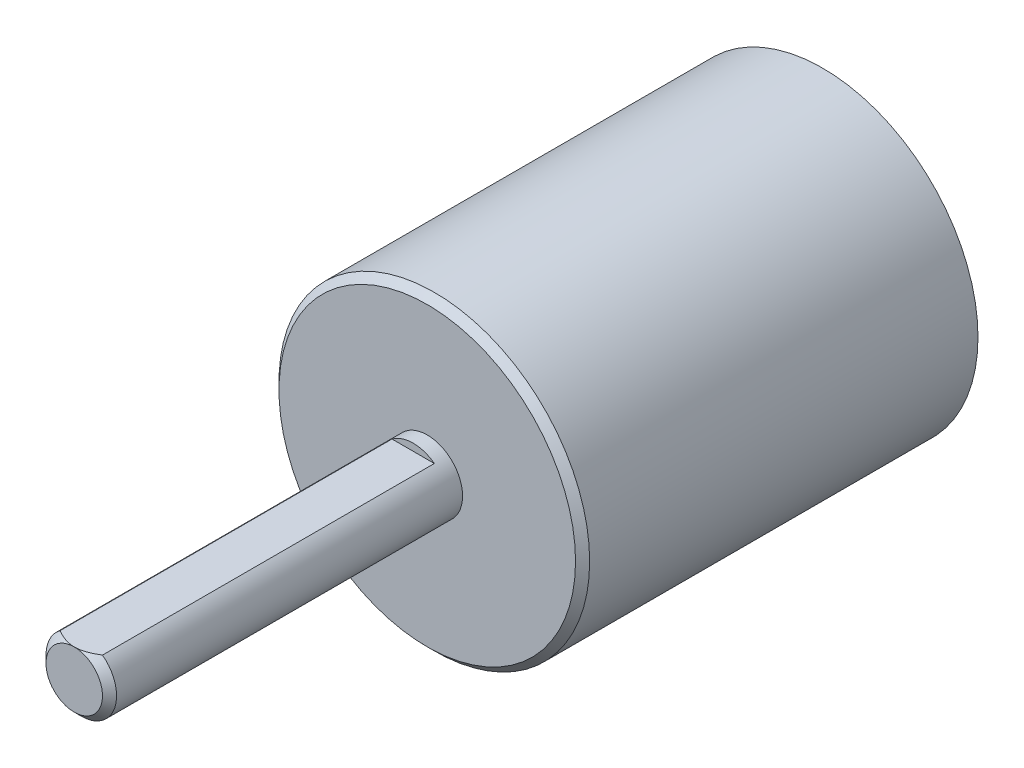
ISO-10303-21;
HEADER;
FILE_DESCRIPTION(('STEP AP214'),'2;1');
FILE_NAME('part.step','',(''),(''),'','','');
FILE_SCHEMA(('AUTOMOTIVE_DESIGN { 1 0 10303 214 1 1 1 1 }'));
ENDSEC;
DATA;
#1=APPLICATION_CONTEXT('core data for automotive mechanical design processes');
#2=APPLICATION_PROTOCOL_DEFINITION('international standard','automotive_design',2000,#1);
#3=PRODUCT_CONTEXT('',#1,'mechanical');
#4=PRODUCT('Part','Part','',(#3));
#5=PRODUCT_RELATED_PRODUCT_CATEGORY('part','',(#4));
#6=PRODUCT_DEFINITION_FORMATION('','',#4);
#7=PRODUCT_DEFINITION_CONTEXT('part definition',#1,'design');
#8=PRODUCT_DEFINITION('design','',#6,#7);
#9=PRODUCT_DEFINITION_SHAPE('','',#8);
#10=(LENGTH_UNIT() NAMED_UNIT(*) SI_UNIT(.MILLI.,.METRE.));
#11=(NAMED_UNIT(*) PLANE_ANGLE_UNIT() SI_UNIT($,.RADIAN.));
#12=(NAMED_UNIT(*) SI_UNIT($,.STERADIAN.) SOLID_ANGLE_UNIT());
#13=UNCERTAINTY_MEASURE_WITH_UNIT(LENGTH_MEASURE(1.E-05),#10,'distance_accuracy_value','');
#14=(GEOMETRIC_REPRESENTATION_CONTEXT(3) GLOBAL_UNCERTAINTY_ASSIGNED_CONTEXT((#13)) GLOBAL_UNIT_ASSIGNED_CONTEXT((#10,
#11,#12)) REPRESENTATION_CONTEXT('',''));
#15=CARTESIAN_POINT('',(0.,0.,0.));
#16=DIRECTION('',(0.,0.,1.));
#17=DIRECTION('',(1.,0.,0.));
#18=AXIS2_PLACEMENT_3D('',#15,#16,#17);
#19=CARTESIAN_POINT('',(0.,0.,53.));
#20=DIRECTION('',(0.,0.,-1.));
#21=DIRECTION('',(-1.,0.,0.));
#22=AXIS2_PLACEMENT_3D('',#19,#20,#21);
#23=CYLINDRICAL_SURFACE('',#22,2.5);
#24=CARTESIAN_POINT('',(0.,0.,28.));
#25=DIRECTION('',(0.,0.,1.));
#26=DIRECTION('',(1.,0.,0.));
#27=AXIS2_PLACEMENT_3D('',#24,#25,#26);
#28=CIRCLE('',#27,2.5);
#29=CARTESIAN_POINT('',(2.5,0.,28.));
#30=VERTEX_POINT('',#29);
#31=EDGE_CURVE('E100',#30,#30,#28,.T.);
#32=ORIENTED_EDGE('',*,*,#31,.T.);
#33=EDGE_LOOP('',(#32));
#34=FACE_BOUND('',#33,.T.);
#35=DIRECTION('',(0.,0.,1.));
#36=VECTOR('',#35,1.);
#37=CARTESIAN_POINT('',(1.5,2.,29.));
#38=LINE('',#37,#36);
#39=CARTESIAN_POINT('',(1.5,2.,29.));
#40=VERTEX_POINT('',#39);
#41=CARTESIAN_POINT('',(1.5,2.,52.5));
#42=VERTEX_POINT('',#41);
#43=EDGE_CURVE('E85',#40,#42,#38,.T.);
#44=ORIENTED_EDGE('',*,*,#43,.T.);
#45=CARTESIAN_POINT('',(0.,0.,52.5));
#46=DIRECTION('',(0.,0.,1.));
#47=DIRECTION('',(1.,0.,0.));
#48=AXIS2_PLACEMENT_3D('',#45,#46,#47);
#49=CIRCLE('',#48,2.5);
#50=CARTESIAN_POINT('',(-1.5,2.,52.5));
#51=VERTEX_POINT('',#50);
#52=EDGE_CURVE('E11',#42,#51,#49,.F.);
#53=ORIENTED_EDGE('',*,*,#52,.T.);
#54=DIRECTION('',(0.,0.,1.));
#55=VECTOR('',#54,1.);
#56=CARTESIAN_POINT('',(-1.5,2.,29.));
#57=LINE('',#56,#55);
#58=CARTESIAN_POINT('',(-1.5,2.,29.));
#59=VERTEX_POINT('',#58);
#60=EDGE_CURVE('E83',#59,#51,#57,.T.);
#61=ORIENTED_EDGE('',*,*,#60,.F.);
#62=CARTESIAN_POINT('',(0.,0.,29.));
#63=DIRECTION('',(0.,0.,1.));
#64=DIRECTION('',(1.,0.,0.));
#65=AXIS2_PLACEMENT_3D('',#62,#63,#64);
#66=CIRCLE('',#65,2.5);
#67=EDGE_CURVE('E89',#40,#59,#66,.T.);
#68=ORIENTED_EDGE('',*,*,#67,.F.);
#69=EDGE_LOOP('',(#44,#53,#61,#68));
#70=FACE_BOUND('',#69,.T.);
#71=ADVANCED_FACE('F49',(#34,#70),#23,.T.);
#72=CARTESIAN_POINT('',(0.,0.,53.));
#73=DIRECTION('',(0.,0.,1.));
#74=DIRECTION('',(1.,0.,0.));
#75=AXIS2_PLACEMENT_3D('',#72,#73,#74);
#76=PLANE('',#75);
#77=CARTESIAN_POINT('',(0.,0.,53.));
#78=DIRECTION('',(0.,0.,1.));
#79=DIRECTION('',(1.,0.,0.));
#80=AXIS2_PLACEMENT_3D('',#77,#78,#79);
#81=CIRCLE('',#80,2.00000000000001);
#82=CARTESIAN_POINT('',(0.,2.,53.));
#83=VERTEX_POINT('',#82);
#84=EDGE_CURVE('E115',#83,#83,#81,.T.);
#85=ORIENTED_EDGE('',*,*,#84,.T.);
#86=EDGE_LOOP('',(#85));
#87=FACE_BOUND('',#86,.T.);
#88=ADVANCED_FACE('F135',(#87),#76,.T.);
#89=CARTESIAN_POINT('',(0.,0.,28.));
#90=DIRECTION('',(0.,0.,-1.));
#91=DIRECTION('',(-1.,0.,0.));
#92=AXIS2_PLACEMENT_3D('',#89,#90,#91);
#93=CYLINDRICAL_SURFACE('',#92,11.);
#94=CARTESIAN_POINT('',(0.,0.,27.5));
#95=DIRECTION('',(0.,0.,1.));
#96=DIRECTION('',(1.,0.,0.));
#97=AXIS2_PLACEMENT_3D('',#94,#95,#96);
#98=CIRCLE('',#97,11.);
#99=CARTESIAN_POINT('',(11.,0.,27.5));
#100=VERTEX_POINT('',#99);
#101=EDGE_CURVE('E111',#100,#100,#98,.F.);
#102=ORIENTED_EDGE('',*,*,#101,.T.);
#103=EDGE_LOOP('',(#102));
#104=FACE_BOUND('',#103,.T.);
#105=CARTESIAN_POINT('',(0.,0.,0.));
#106=DIRECTION('',(0.,0.,1.));
#107=DIRECTION('',(1.,0.,0.));
#108=AXIS2_PLACEMENT_3D('',#105,#106,#107);
#109=CIRCLE('',#108,11.);
#110=CARTESIAN_POINT('',(11.,0.,0.));
#111=VERTEX_POINT('',#110);
#112=EDGE_CURVE('E97',#111,#111,#109,.T.);
#113=ORIENTED_EDGE('',*,*,#112,.T.);
#114=EDGE_LOOP('',(#113));
#115=FACE_BOUND('',#114,.T.);
#116=ADVANCED_FACE('F139',(#104,#115),#93,.T.);
#117=CARTESIAN_POINT('',(0.,0.,28.));
#118=DIRECTION('',(0.,0.,1.));
#119=DIRECTION('',(1.,0.,0.));
#120=AXIS2_PLACEMENT_3D('',#117,#118,#119);
#121=PLANE('',#120);
#122=CARTESIAN_POINT('',(0.,0.,28.));
#123=DIRECTION('',(0.,0.,1.));
#124=DIRECTION('',(1.,0.,0.));
#125=AXIS2_PLACEMENT_3D('',#122,#123,#124);
#126=CIRCLE('',#125,10.5);
#127=CARTESIAN_POINT('',(10.5,0.,28.));
#128=VERTEX_POINT('',#127);
#129=EDGE_CURVE('E104',#128,#128,#126,.T.);
#130=ORIENTED_EDGE('',*,*,#129,.T.);
#131=EDGE_LOOP('',(#130));
#132=FACE_BOUND('',#131,.T.);
#133=ORIENTED_EDGE('',*,*,#31,.F.);
#134=EDGE_LOOP('',(#133));
#135=FACE_BOUND('',#134,.T.);
#136=ADVANCED_FACE('F144',(#132,#135),#121,.T.);
#137=CARTESIAN_POINT('',(0.,0.,0.));
#138=DIRECTION('',(0.,0.,1.));
#139=DIRECTION('',(1.,0.,0.));
#140=AXIS2_PLACEMENT_3D('',#137,#138,#139);
#141=PLANE('',#140);
#142=ORIENTED_EDGE('',*,*,#112,.F.);
#143=EDGE_LOOP('',(#142));
#144=FACE_BOUND('',#143,.T.);
#145=ADVANCED_FACE('F134',(#144),#141,.F.);
#146=CARTESIAN_POINT('',(0.,2.,29.));
#147=DIRECTION('',(0.,1.,0.));
#148=DIRECTION('',(0.,0.,1.));
#149=AXIS2_PLACEMENT_3D('',#146,#147,#148);
#150=PLANE('',#149);
#151=CARTESIAN_POINT('',(-1.5,2.,52.5));
#152=CARTESIAN_POINT('',(-1.42763018659213,2.,52.5433736980276));
#153=CARTESIAN_POINT('',(-1.35436226532257,2.,52.5853687019536));
#154=CARTESIAN_POINT('',(-1.20549660628809,2.,52.6656443583189));
#155=CARTESIAN_POINT('',(-1.12989157710705,2.,52.7039114197062));
#156=CARTESIAN_POINT('',(-0.978296734874827,2.,52.774534191742));
#157=CARTESIAN_POINT('',(-0.902366736266402,2.,52.8070165390548));
#158=CARTESIAN_POINT('',(-0.748220644904069,2.,52.865809016699));
#159=CARTESIAN_POINT('',(-0.670007876047701,2.,52.8921276624893));
#160=CARTESIAN_POINT('',(-0.543060600019243,2.,52.9280861032667));
#161=CARTESIAN_POINT('',(-0.495021163503641,2.,52.9401901027996));
#162=CARTESIAN_POINT('',(-0.398260419217582,2.,52.9612794306282));
#163=CARTESIAN_POINT('',(-0.349539198139855,2.,52.9702651517484));
#164=CARTESIAN_POINT('',(-0.250852177401959,2.,52.9849271240241));
#165=CARTESIAN_POINT('',(-0.20087865403863,2.,52.9905520018212));
#166=CARTESIAN_POINT('',(-0.100607619276172,2.,52.9981023484678));
#167=CARTESIAN_POINT('',(-0.0503098472705266,2.,53.0000243314446));
#168=CARTESIAN_POINT('',(0.,2.,53.));
#169=B_SPLINE_CURVE_WITH_KNOTS('',3,(#151,#152,#153,#154,#155,#156,#157,#158,#159,#160,#161,
#162,#163,#164,#165,#166,#167,#168),.UNSPECIFIED.,.F.,.F.,(4,2,2,2,2,2,2,2,4),(0.,
0.253195034695597,0.507281075974288,0.754837752612879,1.00205037282501,1.15058504578388,
1.29910100031797,1.44983263801686,1.60070610394699),.UNSPECIFIED.);
#170=EDGE_CURVE('E119',#51,#83,#169,.T.);
#171=ORIENTED_EDGE('',*,*,#170,.T.);
#172=CARTESIAN_POINT('',(0.,2.00000000000001,53.));
#173=CARTESIAN_POINT('',(0.0614966481035623,2.,53.0000514930088));
#174=CARTESIAN_POINT('',(0.12296179611878,2.,52.997164788165));
#175=CARTESIAN_POINT('',(0.245274670057059,2.,52.9859212389057));
#176=CARTESIAN_POINT('',(0.306123362775479,2.,52.9775750221521));
#177=CARTESIAN_POINT('',(0.425885509906891,2.,52.9559969816614));
#178=CARTESIAN_POINT('',(0.484814317272308,2.,52.9428488248966));
#179=CARTESIAN_POINT('',(0.601555526074533,2.,52.9122507618696));
#180=CARTESIAN_POINT('',(0.659367456410754,2.,52.8947990813251));
#181=CARTESIAN_POINT('',(0.784576263433314,2.,52.8525702057821));
#182=CARTESIAN_POINT('',(0.851714510760656,2.,52.8270315815753));
#183=CARTESIAN_POINT('',(0.984250024576911,2.,52.7717452055525));
#184=CARTESIAN_POINT('',(1.04964642506795,2.,52.7419954048129));
#185=CARTESIAN_POINT('',(1.18016546542205,2.,52.6784785026746));
#186=CARTESIAN_POINT('',(1.24525271545219,2.,52.6446394298057));
#187=CARTESIAN_POINT('',(1.37378197006118,2.,52.5742160914668));
#188=CARTESIAN_POINT('',(1.43722666174302,2.,52.5376367483736));
#189=CARTESIAN_POINT('',(1.5,2.,52.5));
#190=B_SPLINE_CURVE_WITH_KNOTS('',3,(#172,#173,#174,#175,#176,#177,#178,#179,#180,#181,#182,
#183,#184,#185,#186,#187,#188,#189),.UNSPECIFIED.,.F.,.F.,(4,2,2,2,2,2,2,2,4),(0.,
0.184371949240825,0.368386057907037,0.549336051664292,0.730360773654886,0.945674044871393,
1.16109243790835,1.38109142427278,1.60070428639641),.UNSPECIFIED.);
#191=EDGE_CURVE('E60',#83,#42,#190,.T.);
#192=ORIENTED_EDGE('',*,*,#191,.T.);
#193=ORIENTED_EDGE('',*,*,#43,.F.);
#194=DIRECTION('',(-1.,0.,0.));
#195=VECTOR('',#194,1.);
#196=CARTESIAN_POINT('',(0.,2.,29.));
#197=LINE('',#196,#195);
#198=EDGE_CURVE('E80',#40,#59,#197,.T.);
#199=ORIENTED_EDGE('',*,*,#198,.T.);
#200=ORIENTED_EDGE('',*,*,#60,.T.);
#201=EDGE_LOOP('',(#171,#192,#193,#199,#200));
#202=FACE_BOUND('',#201,.T.);
#203=ADVANCED_FACE('F82',(#202),#150,.T.);
#204=CARTESIAN_POINT('',(0.,0.,29.));
#205=DIRECTION('',(0.,0.,1.));
#206=DIRECTION('',(1.,0.,0.));
#207=AXIS2_PLACEMENT_3D('',#204,#205,#206);
#208=PLANE('',#207);
#209=ORIENTED_EDGE('',*,*,#67,.T.);
#210=ORIENTED_EDGE('',*,*,#198,.F.);
#211=EDGE_LOOP('',(#209,#210));
#212=FACE_BOUND('',#211,.T.);
#213=ADVANCED_FACE('F91',(#212),#208,.T.);
#214=CARTESIAN_POINT('',(0.,0.,28.));
#215=DIRECTION('',(0.,0.,-1.));
#216=DIRECTION('',(-1.,0.,0.));
#217=AXIS2_PLACEMENT_3D('',#214,#215,#216);
#218=CONICAL_SURFACE('',#217,10.5,0.785398163397455);
#219=ORIENTED_EDGE('',*,*,#101,.F.);
#220=EDGE_LOOP('',(#219));
#221=FACE_BOUND('',#220,.T.);
#222=ORIENTED_EDGE('',*,*,#129,.F.);
#223=EDGE_LOOP('',(#222));
#224=FACE_BOUND('',#223,.T.);
#225=ADVANCED_FACE('F154',(#221,#224),#218,.T.);
#226=CARTESIAN_POINT('',(0.,0.,53.));
#227=DIRECTION('',(0.,0.,-1.));
#228=DIRECTION('',(-1.,0.,0.));
#229=AXIS2_PLACEMENT_3D('',#226,#227,#228);
#230=CONICAL_SURFACE('',#229,2.00000000000001,0.785398163397446);
#231=ORIENTED_EDGE('',*,*,#170,.F.);
#232=ORIENTED_EDGE('',*,*,#52,.F.);
#233=ORIENTED_EDGE('',*,*,#191,.F.);
#234=ORIENTED_EDGE('',*,*,#84,.F.);
#235=EDGE_LOOP('',(#231,#232,#233,#234));
#236=FACE_BOUND('',#235,.T.);
#237=ADVANCED_FACE('F52',(#236),#230,.T.);
#238=CLOSED_SHELL('',(#71,#88,#116,#136,#145,#203,#213,#225,#237));
#239=MANIFOLD_SOLID_BREP('B2',#238);
#240=ADVANCED_BREP_SHAPE_REPRESENTATION('',(#18,#239),#14);
#241=SHAPE_DEFINITION_REPRESENTATION(#9,#240);
ENDSEC;
END-ISO-10303-21;
